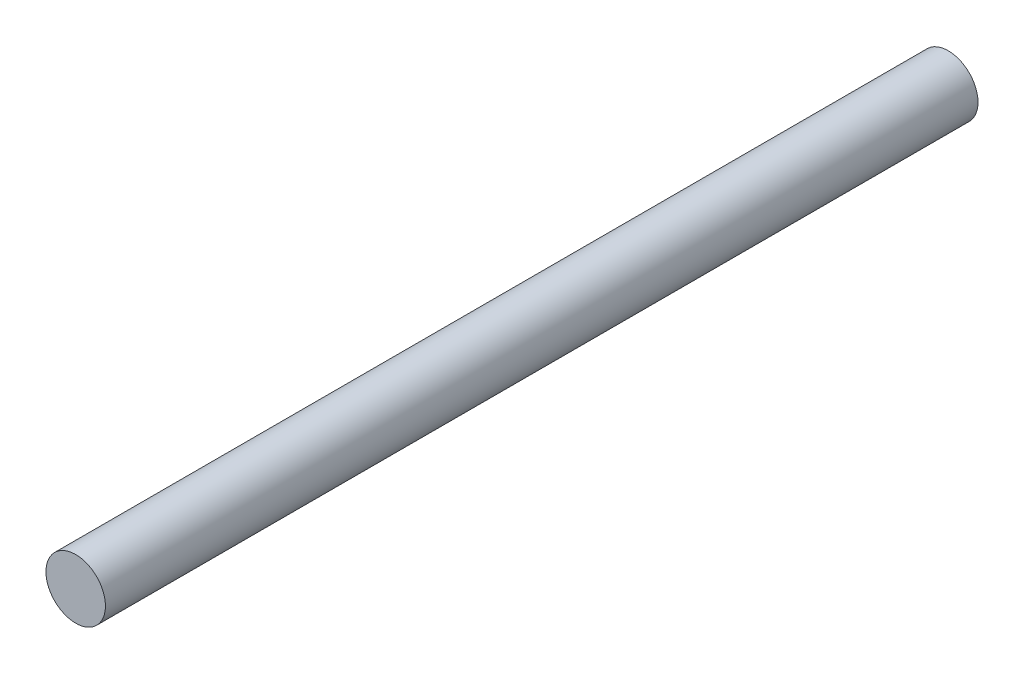
ISO-10303-21;
HEADER;
FILE_DESCRIPTION(('STEP AP214'),'2;1');
FILE_NAME('part.step','',(''),(''),'','','');
FILE_SCHEMA(('AUTOMOTIVE_DESIGN { 1 0 10303 214 1 1 1 1 }'));
ENDSEC;
DATA;
#1=APPLICATION_CONTEXT('core data for automotive mechanical design processes');
#2=APPLICATION_PROTOCOL_DEFINITION('international standard','automotive_design',2000,#1);
#3=PRODUCT_CONTEXT('',#1,'mechanical');
#4=PRODUCT('Part','Part','',(#3));
#5=PRODUCT_RELATED_PRODUCT_CATEGORY('part','',(#4));
#6=PRODUCT_DEFINITION_FORMATION('','',#4);
#7=PRODUCT_DEFINITION_CONTEXT('part definition',#1,'design');
#8=PRODUCT_DEFINITION('design','',#6,#7);
#9=PRODUCT_DEFINITION_SHAPE('','',#8);
#10=(LENGTH_UNIT() NAMED_UNIT(*) SI_UNIT(.MILLI.,.METRE.));
#11=(NAMED_UNIT(*) PLANE_ANGLE_UNIT() SI_UNIT($,.RADIAN.));
#12=(NAMED_UNIT(*) SI_UNIT($,.STERADIAN.) SOLID_ANGLE_UNIT());
#13=UNCERTAINTY_MEASURE_WITH_UNIT(LENGTH_MEASURE(1.E-05),#10,'distance_accuracy_value','');
#14=(GEOMETRIC_REPRESENTATION_CONTEXT(3) GLOBAL_UNCERTAINTY_ASSIGNED_CONTEXT((#13)) GLOBAL_UNIT_ASSIGNED_CONTEXT((#10,
#11,#12)) REPRESENTATION_CONTEXT('',''));
#15=CARTESIAN_POINT('',(0.,0.,0.));
#16=DIRECTION('',(0.,0.,1.));
#17=DIRECTION('',(1.,0.,0.));
#18=AXIS2_PLACEMENT_3D('',#15,#16,#17);
#19=CARTESIAN_POINT('',(0.,0.,44.));
#20=DIRECTION('',(0.,0.,-1.));
#21=DIRECTION('',(-1.,0.,0.));
#22=AXIS2_PLACEMENT_3D('',#19,#20,#21);
#23=CYLINDRICAL_SURFACE('',#22,1.5);
#24=CARTESIAN_POINT('',(0.,0.,44.));
#25=DIRECTION('',(0.,0.,1.));
#26=DIRECTION('',(1.,0.,0.));
#27=AXIS2_PLACEMENT_3D('',#24,#25,#26);
#28=CIRCLE('',#27,1.5);
#29=CARTESIAN_POINT('',(1.5,0.,44.));
#30=VERTEX_POINT('',#29);
#31=EDGE_CURVE('E10',#30,#30,#28,.T.);
#32=ORIENTED_EDGE('',*,*,#31,.F.);
#33=EDGE_LOOP('',(#32));
#34=FACE_BOUND('',#33,.T.);
#35=CARTESIAN_POINT('',(0.,0.,0.));
#36=DIRECTION('',(0.,0.,1.));
#37=DIRECTION('',(1.,0.,0.));
#38=AXIS2_PLACEMENT_3D('',#35,#36,#37);
#39=CIRCLE('',#38,1.5);
#40=CARTESIAN_POINT('',(1.5,0.,0.));
#41=VERTEX_POINT('',#40);
#42=EDGE_CURVE('E37',#41,#41,#39,.T.);
#43=ORIENTED_EDGE('',*,*,#42,.T.);
#44=EDGE_LOOP('',(#43));
#45=FACE_BOUND('',#44,.T.);
#46=ADVANCED_FACE('F34',(#34,#45),#23,.T.);
#47=CARTESIAN_POINT('',(0.,0.,44.));
#48=DIRECTION('',(0.,0.,1.));
#49=DIRECTION('',(1.,0.,0.));
#50=AXIS2_PLACEMENT_3D('',#47,#48,#49);
#51=PLANE('',#50);
#52=ORIENTED_EDGE('',*,*,#31,.T.);
#53=EDGE_LOOP('',(#52));
#54=FACE_BOUND('',#53,.T.);
#55=ADVANCED_FACE('F49',(#54),#51,.T.);
#56=CARTESIAN_POINT('',(0.,0.,0.));
#57=DIRECTION('',(0.,0.,1.));
#58=DIRECTION('',(1.,0.,0.));
#59=AXIS2_PLACEMENT_3D('',#56,#57,#58);
#60=PLANE('',#59);
#61=ORIENTED_EDGE('',*,*,#42,.F.);
#62=EDGE_LOOP('',(#61));
#63=FACE_BOUND('',#62,.T.);
#64=ADVANCED_FACE('F47',(#63),#60,.F.);
#65=CLOSED_SHELL('',(#46,#55,#64));
#66=MANIFOLD_SOLID_BREP('B2',#65);
#67=ADVANCED_BREP_SHAPE_REPRESENTATION('',(#18,#66),#14);
#68=SHAPE_DEFINITION_REPRESENTATION(#9,#67);
ENDSEC;
END-ISO-10303-21;
